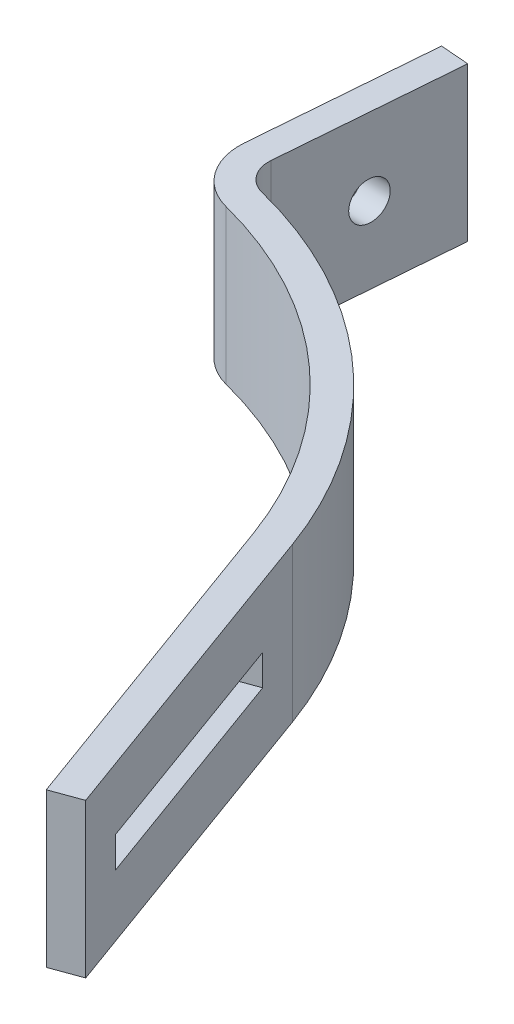
ISO-10303-21;
HEADER;
FILE_DESCRIPTION(('STEP AP214'),'2;1');
FILE_NAME('part.step','',(''),(''),'','','');
FILE_SCHEMA(('AUTOMOTIVE_DESIGN { 1 0 10303 214 1 1 1 1 }'));
ENDSEC;
DATA;
#1=APPLICATION_CONTEXT('core data for automotive mechanical design processes');
#2=APPLICATION_PROTOCOL_DEFINITION('international standard','automotive_design',2000,#1);
#3=PRODUCT_CONTEXT('',#1,'mechanical');
#4=PRODUCT('Part','Part','',(#3));
#5=PRODUCT_RELATED_PRODUCT_CATEGORY('part','',(#4));
#6=PRODUCT_DEFINITION_FORMATION('','',#4);
#7=PRODUCT_DEFINITION_CONTEXT('part definition',#1,'design');
#8=PRODUCT_DEFINITION('design','',#6,#7);
#9=PRODUCT_DEFINITION_SHAPE('','',#8);
#10=(LENGTH_UNIT() NAMED_UNIT(*) SI_UNIT(.MILLI.,.METRE.));
#11=(NAMED_UNIT(*) PLANE_ANGLE_UNIT() SI_UNIT($,.RADIAN.));
#12=(NAMED_UNIT(*) SI_UNIT($,.STERADIAN.) SOLID_ANGLE_UNIT());
#13=UNCERTAINTY_MEASURE_WITH_UNIT(LENGTH_MEASURE(1.E-05),#10,'distance_accuracy_value','');
#14=(GEOMETRIC_REPRESENTATION_CONTEXT(3) GLOBAL_UNCERTAINTY_ASSIGNED_CONTEXT((#13)) GLOBAL_UNIT_ASSIGNED_CONTEXT((#10,
#11,#12)) REPRESENTATION_CONTEXT('',''));
#15=CARTESIAN_POINT('',(0.,0.,0.));
#16=DIRECTION('',(0.,0.,1.));
#17=DIRECTION('',(1.,0.,0.));
#18=AXIS2_PLACEMENT_3D('',#15,#16,#17);
#19=CARTESIAN_POINT('',(-27.1708769324458,10.,-54.5665199545642));
#20=DIRECTION('',(-0.0798529081578771,0.,0.996806657812201));
#21=DIRECTION('',(0.996806657812201,0.,0.0798529081578771));
#22=AXIS2_PLACEMENT_3D('',#19,#20,#21);
#23=PLANE('',#22);
#24=DIRECTION('',(-0.996806657812201,0.,-0.0798529081578771));
#25=VECTOR('',#24,1.);
#26=CARTESIAN_POINT('',(-27.1708769324458,0.,-54.5665199545642));
#27=LINE('',#26,#25);
#28=CARTESIAN_POINT('',(-27.1708769324458,0.,-54.5665199545642));
#29=VERTEX_POINT('',#28);
#30=CARTESIAN_POINT('',(-29.0231215445682,0.,-54.7149009046096));
#31=VERTEX_POINT('',#30);
#32=EDGE_CURVE('E175',#29,#31,#27,.T.);
#33=ORIENTED_EDGE('',*,*,#32,.T.);
#34=DIRECTION('',(0.,-1.,0.));
#35=VECTOR('',#34,1.);
#36=CARTESIAN_POINT('',(-29.0231215445682,10.,-54.7149009046096));
#37=LINE('',#36,#35);
#38=CARTESIAN_POINT('',(-29.0231215445682,10.,-54.7149009046096));
#39=VERTEX_POINT('',#38);
#40=EDGE_CURVE('E11',#39,#31,#37,.T.);
#41=ORIENTED_EDGE('',*,*,#40,.F.);
#42=DIRECTION('',(-0.996806657812201,0.,-0.0798529081578771));
#43=VECTOR('',#42,1.);
#44=CARTESIAN_POINT('',(-27.1708769324458,10.,-54.5665199545642));
#45=LINE('',#44,#43);
#46=CARTESIAN_POINT('',(-27.1708769324458,10.,-54.5665199545642));
#47=VERTEX_POINT('',#46);
#48=EDGE_CURVE('E176',#47,#39,#45,.T.);
#49=ORIENTED_EDGE('',*,*,#48,.F.);
#50=DIRECTION('',(0.,-1.,0.));
#51=VECTOR('',#50,1.);
#52=CARTESIAN_POINT('',(-27.1708769324458,10.,-54.5665199545642));
#53=LINE('',#52,#51);
#54=EDGE_CURVE('E198',#47,#29,#53,.T.);
#55=ORIENTED_EDGE('',*,*,#54,.T.);
#56=EDGE_LOOP('',(#33,#41,#49,#55));
#57=FACE_BOUND('',#56,.T.);
#58=ADVANCED_FACE('F34',(#57),#23,.F.);
#59=CARTESIAN_POINT('',(-29.9724651651477,10.,-42.8642111379429));
#60=DIRECTION('',(0.9968066578122,0.,0.07985290815788));
#61=DIRECTION('',(0.07985290815788,0.,-0.9968066578122));
#62=AXIS2_PLACEMENT_3D('',#59,#60,#61);
#63=PLANE('',#62);
#64=CARTESIAN_POINT('',(-29.5087010246641,5.,-48.6533951958932));
#65=DIRECTION('',(0.9968066578122,0.,0.07985290815788));
#66=DIRECTION('',(0.07985290815788,0.,-0.996806657812201));
#67=AXIS2_PLACEMENT_3D('',#64,#65,#66);
#68=ELLIPSE('',#67,1.25400446536293,1.25);
#69=CARTESIAN_POINT('',(-29.4085651212619,5.,-49.9033951958932));
#70=VERTEX_POINT('',#69);
#71=EDGE_CURVE('E172',#70,#70,#68,.T.);
#72=ORIENTED_EDGE('',*,*,#71,.T.);
#73=EDGE_LOOP('',(#72));
#74=FACE_BOUND('',#73,.T.);
#75=DIRECTION('',(-0.07985290815788,0.,0.9968066578122));
#76=VECTOR('',#75,1.);
#77=CARTESIAN_POINT('',(-29.9724651651477,0.,-42.8642111379429));
#78=LINE('',#77,#76);
#79=CARTESIAN_POINT('',(-29.9724651651477,0.,-42.8642111379429));
#80=VERTEX_POINT('',#79);
#81=EDGE_CURVE('E201',#31,#80,#78,.T.);
#82=ORIENTED_EDGE('',*,*,#81,.T.);
#83=DIRECTION('',(0.,-1.,0.));
#84=VECTOR('',#83,1.);
#85=CARTESIAN_POINT('',(-29.9724651651477,10.,-42.8642111379429));
#86=LINE('',#85,#84);
#87=CARTESIAN_POINT('',(-29.9724651651477,10.,-42.8642111379429));
#88=VERTEX_POINT('',#87);
#89=EDGE_CURVE('E42',#88,#80,#86,.T.);
#90=ORIENTED_EDGE('',*,*,#89,.F.);
#91=DIRECTION('',(-0.07985290815788,0.,0.9968066578122));
#92=VECTOR('',#91,1.);
#93=CARTESIAN_POINT('',(-29.9724651651477,10.,-42.8642111379429));
#94=LINE('',#93,#92);
#95=EDGE_CURVE('E179',#39,#88,#94,.T.);
#96=ORIENTED_EDGE('',*,*,#95,.F.);
#97=ORIENTED_EDGE('',*,*,#40,.T.);
#98=EDGE_LOOP('',(#82,#90,#96,#97));
#99=FACE_BOUND('',#98,.T.);
#100=ADVANCED_FACE('F269',(#74,#99),#63,.F.);
#101=CARTESIAN_POINT('',(-25.9852385338989,10.,-42.5447995053113));
#102=DIRECTION('',(0.,-1.,0.));
#103=DIRECTION('',(0.,0.,-1.));
#104=AXIS2_PLACEMENT_3D('',#101,#102,#103);
#105=CYLINDRICAL_SURFACE('',#104,4.);
#106=CARTESIAN_POINT('',(-25.9852385338989,0.,-42.5447995053113));
#107=DIRECTION('',(0.,1.,0.));
#108=DIRECTION('',(0.,0.,1.));
#109=AXIS2_PLACEMENT_3D('',#106,#107,#108);
#110=CIRCLE('',#109,4.);
#111=CARTESIAN_POINT('',(-26.9879395430156,0.,-38.6725145614679));
#112=VERTEX_POINT('',#111);
#113=EDGE_CURVE('E203',#80,#112,#110,.T.);
#114=ORIENTED_EDGE('',*,*,#113,.T.);
#115=DIRECTION('',(0.,-1.,0.));
#116=VECTOR('',#115,1.);
#117=CARTESIAN_POINT('',(-26.9879395430156,10.,-38.6725145614679));
#118=LINE('',#117,#116);
#119=CARTESIAN_POINT('',(-26.9879395430156,10.,-38.6725145614679));
#120=VERTEX_POINT('',#119);
#121=EDGE_CURVE('E238',#120,#112,#118,.T.);
#122=ORIENTED_EDGE('',*,*,#121,.F.);
#123=CARTESIAN_POINT('',(-25.9852385338989,10.,-42.5447995053113));
#124=DIRECTION('',(0.,1.,0.));
#125=DIRECTION('',(0.,0.,1.));
#126=AXIS2_PLACEMENT_3D('',#123,#124,#125);
#127=CIRCLE('',#126,4.);
#128=EDGE_CURVE('E182',#88,#120,#127,.T.);
#129=ORIENTED_EDGE('',*,*,#128,.F.);
#130=ORIENTED_EDGE('',*,*,#89,.T.);
#131=EDGE_LOOP('',(#114,#122,#129,#130));
#132=FACE_BOUND('',#131,.T.);
#133=ADVANCED_FACE('F246',(#132),#105,.T.);
#134=CARTESIAN_POINT('',(-34.006846606833,10.,-11.5665199545642));
#135=DIRECTION('',(0.,-1.,0.));
#136=DIRECTION('',(0.,0.,-1.));
#137=AXIS2_PLACEMENT_3D('',#134,#135,#136);
#138=CYLINDRICAL_SURFACE('',#137,28.);
#139=CARTESIAN_POINT('',(-34.006846606833,0.,-11.5665199545642));
#140=DIRECTION('',(0.,-1.,0.));
#141=DIRECTION('',(0.,0.,1.));
#142=AXIS2_PLACEMENT_3D('',#139,#140,#141);
#143=CIRCLE('',#142,28.);
#144=CARTESIAN_POINT('',(-7.69545322482755,0.,-21.1430839676829));
#145=VERTEX_POINT('',#144);
#146=EDGE_CURVE('E205',#112,#145,#143,.T.);
#147=ORIENTED_EDGE('',*,*,#146,.T.);
#148=DIRECTION('',(0.,-1.,0.));
#149=VECTOR('',#148,1.);
#150=CARTESIAN_POINT('',(-7.69545322482755,10.,-21.1430839676829));
#151=LINE('',#150,#149);
#152=CARTESIAN_POINT('',(-7.69545322482755,10.,-21.1430839676829));
#153=VERTEX_POINT('',#152);
#154=EDGE_CURVE('E235',#153,#145,#151,.T.);
#155=ORIENTED_EDGE('',*,*,#154,.F.);
#156=CARTESIAN_POINT('',(-34.006846606833,10.,-11.5665199545642));
#157=DIRECTION('',(0.,-1.,0.));
#158=DIRECTION('',(0.,0.,1.));
#159=AXIS2_PLACEMENT_3D('',#156,#157,#158);
#160=CIRCLE('',#159,28.);
#161=EDGE_CURVE('E184',#120,#153,#160,.T.);
#162=ORIENTED_EDGE('',*,*,#161,.F.);
#163=ORIENTED_EDGE('',*,*,#121,.T.);
#164=EDGE_LOOP('',(#147,#155,#162,#163));
#165=FACE_BOUND('',#164,.T.);
#166=ADVANCED_FACE('F257',(#165),#138,.F.);
#167=CARTESIAN_POINT('',(-7.69545322482755,10.,-21.1430839676829));
#168=DIRECTION('',(0.939692620785908,0.,-0.342020143325669));
#169=DIRECTION('',(-0.342020143325669,0.,-0.939692620785908));
#170=AXIS2_PLACEMENT_3D('',#167,#168,#169);
#171=PLANE('',#170);
#172=DIRECTION('',(-0.342020143325669,0.,-0.939692620785908));
#173=VECTOR('',#172,1.);
#174=CARTESIAN_POINT('',(-7.69545322482755,4.,-21.1430839676829));
#175=LINE('',#174,#173);
#176=CARTESIAN_POINT('',(-1.11156546580842,4.,-3.0540010175542));
#177=VERTEX_POINT('',#176);
#178=CARTESIAN_POINT('',(-6.58388775901913,4.,-18.0890829501287));
#179=VERTEX_POINT('',#178);
#180=EDGE_CURVE('E166',#177,#179,#175,.T.);
#181=ORIENTED_EDGE('',*,*,#180,.T.);
#182=DIRECTION('',(0.,1.,0.));
#183=VECTOR('',#182,1.);
#184=CARTESIAN_POINT('',(-6.58388775901913,10.,-18.0890829501287));
#185=LINE('',#184,#183);
#186=CARTESIAN_POINT('',(-6.58388775901913,6.,-18.0890829501287));
#187=VERTEX_POINT('',#186);
#188=EDGE_CURVE('E169',#179,#187,#185,.T.);
#189=ORIENTED_EDGE('',*,*,#188,.T.);
#190=DIRECTION('',(0.342020143325669,0.,0.939692620785908));
#191=VECTOR('',#190,1.);
#192=CARTESIAN_POINT('',(-7.69545322482755,6.,-21.1430839676829));
#193=LINE('',#192,#191);
#194=CARTESIAN_POINT('',(-1.11156546580842,6.,-3.0540010175542));
#195=VERTEX_POINT('',#194);
#196=EDGE_CURVE('E161',#187,#195,#193,.T.);
#197=ORIENTED_EDGE('',*,*,#196,.T.);
#198=DIRECTION('',(0.,-1.,0.));
#199=VECTOR('',#198,1.);
#200=CARTESIAN_POINT('',(-1.11156546580842,10.,-3.0540010175542));
#201=LINE('',#200,#199);
#202=EDGE_CURVE('E141',#195,#177,#201,.T.);
#203=ORIENTED_EDGE('',*,*,#202,.T.);
#204=EDGE_LOOP('',(#181,#189,#197,#203));
#205=FACE_BOUND('',#204,.T.);
#206=DIRECTION('',(0.342020143325669,0.,0.939692620785908));
#207=VECTOR('',#206,1.);
#208=CARTESIAN_POINT('',(-7.69545322482755,0.,-21.1430839676829));
#209=LINE('',#208,#207);
#210=CARTESIAN_POINT('',(0.,0.,0.));
#211=VERTEX_POINT('',#210);
#212=EDGE_CURVE('E207',#145,#211,#209,.T.);
#213=ORIENTED_EDGE('',*,*,#212,.T.);
#214=DIRECTION('',(0.,-1.,0.));
#215=VECTOR('',#214,1.);
#216=CARTESIAN_POINT('',(0.,10.,0.));
#217=LINE('',#216,#215);
#218=CARTESIAN_POINT('',(0.,10.,0.));
#219=VERTEX_POINT('',#218);
#220=EDGE_CURVE('E232',#219,#211,#217,.T.);
#221=ORIENTED_EDGE('',*,*,#220,.F.);
#222=DIRECTION('',(0.342020143325669,0.,0.939692620785908));
#223=VECTOR('',#222,1.);
#224=CARTESIAN_POINT('',(-7.69545322482755,10.,-21.1430839676829));
#225=LINE('',#224,#223);
#226=EDGE_CURVE('E186',#153,#219,#225,.T.);
#227=ORIENTED_EDGE('',*,*,#226,.F.);
#228=ORIENTED_EDGE('',*,*,#154,.T.);
#229=EDGE_LOOP('',(#213,#221,#227,#228));
#230=FACE_BOUND('',#229,.T.);
#231=ADVANCED_FACE('F261',(#205,#230),#171,.F.);
#232=CARTESIAN_POINT('',(0.,10.,0.));
#233=DIRECTION('',(-0.342020143325669,0.,-0.939692620785908));
#234=DIRECTION('',(-0.939692620785908,0.,0.342020143325669));
#235=AXIS2_PLACEMENT_3D('',#232,#233,#234);
#236=PLANE('',#235);
#237=DIRECTION('',(0.939692620785908,0.,-0.342020143325669));
#238=VECTOR('',#237,1.);
#239=CARTESIAN_POINT('',(0.,0.,0.));
#240=LINE('',#239,#238);
#241=CARTESIAN_POINT('',(1.87938524157183,0.,-0.684040286651345));
#242=VERTEX_POINT('',#241);
#243=EDGE_CURVE('E209',#211,#242,#240,.T.);
#244=ORIENTED_EDGE('',*,*,#243,.T.);
#245=DIRECTION('',(0.,-1.,0.));
#246=VECTOR('',#245,1.);
#247=CARTESIAN_POINT('',(1.87938524157183,10.,-0.684040286651345));
#248=LINE('',#247,#246);
#249=CARTESIAN_POINT('',(1.87938524157183,10.,-0.684040286651345));
#250=VERTEX_POINT('',#249);
#251=EDGE_CURVE('E229',#250,#242,#248,.T.);
#252=ORIENTED_EDGE('',*,*,#251,.F.);
#253=DIRECTION('',(0.939692620785908,0.,-0.342020143325669));
#254=VECTOR('',#253,1.);
#255=CARTESIAN_POINT('',(0.,10.,0.));
#256=LINE('',#255,#254);
#257=EDGE_CURVE('E188',#219,#250,#256,.T.);
#258=ORIENTED_EDGE('',*,*,#257,.F.);
#259=ORIENTED_EDGE('',*,*,#220,.T.);
#260=EDGE_LOOP('',(#244,#252,#258,#259));
#261=FACE_BOUND('',#260,.T.);
#262=ADVANCED_FACE('F290',(#261),#236,.F.);
#263=CARTESIAN_POINT('',(-5.81606798325573,10.,-21.8271242543343));
#264=DIRECTION('',(-0.939692620785908,0.,0.342020143325669));
#265=DIRECTION('',(0.342020143325669,0.,0.939692620785908));
#266=AXIS2_PLACEMENT_3D('',#263,#264,#265);
#267=PLANE('',#266);
#268=DIRECTION('',(0.342020143325669,0.,0.939692620785908));
#269=VECTOR('',#268,1.);
#270=CARTESIAN_POINT('',(0.767819775763409,6.,-3.73804130420555));
#271=LINE('',#270,#269);
#272=CARTESIAN_POINT('',(-4.7045025174473,6.,-18.7731232367801));
#273=VERTEX_POINT('',#272);
#274=CARTESIAN_POINT('',(0.767819775763409,6.,-3.73804130420555));
#275=VERTEX_POINT('',#274);
#276=EDGE_CURVE('E147',#273,#275,#271,.T.);
#277=ORIENTED_EDGE('',*,*,#276,.F.);
#278=DIRECTION('',(0.,1.,0.));
#279=VECTOR('',#278,1.);
#280=CARTESIAN_POINT('',(-4.7045025174473,4.,-18.7731232367801));
#281=LINE('',#280,#279);
#282=CARTESIAN_POINT('',(-4.7045025174473,4.,-18.7731232367801));
#283=VERTEX_POINT('',#282);
#284=EDGE_CURVE('E57',#283,#273,#281,.T.);
#285=ORIENTED_EDGE('',*,*,#284,.F.);
#286=DIRECTION('',(-0.342020143325669,0.,-0.939692620785908));
#287=VECTOR('',#286,1.);
#288=CARTESIAN_POINT('',(0.767819775763409,4.,-3.73804130420555));
#289=LINE('',#288,#287);
#290=CARTESIAN_POINT('',(0.767819775763409,4.,-3.73804130420555));
#291=VERTEX_POINT('',#290);
#292=EDGE_CURVE('E154',#291,#283,#289,.T.);
#293=ORIENTED_EDGE('',*,*,#292,.F.);
#294=DIRECTION('',(0.,-1.,0.));
#295=VECTOR('',#294,1.);
#296=CARTESIAN_POINT('',(0.767819775763409,6.,-3.73804130420555));
#297=LINE('',#296,#295);
#298=EDGE_CURVE('E138',#275,#291,#297,.T.);
#299=ORIENTED_EDGE('',*,*,#298,.F.);
#300=EDGE_LOOP('',(#277,#285,#293,#299));
#301=FACE_BOUND('',#300,.T.);
#302=DIRECTION('',(-0.342020143325669,0.,-0.939692620785908));
#303=VECTOR('',#302,1.);
#304=CARTESIAN_POINT('',(-5.81606798325573,0.,-21.8271242543343));
#305=LINE('',#304,#303);
#306=CARTESIAN_POINT('',(-5.81606798325573,0.,-21.8271242543343));
#307=VERTEX_POINT('',#306);
#308=EDGE_CURVE('E211',#242,#307,#305,.T.);
#309=ORIENTED_EDGE('',*,*,#308,.T.);
#310=DIRECTION('',(0.,-1.,0.));
#311=VECTOR('',#310,1.);
#312=CARTESIAN_POINT('',(-5.81606798325573,10.,-21.8271242543343));
#313=LINE('',#312,#311);
#314=CARTESIAN_POINT('',(-5.81606798325573,10.,-21.8271242543343));
#315=VERTEX_POINT('',#314);
#316=EDGE_CURVE('E226',#315,#307,#313,.T.);
#317=ORIENTED_EDGE('',*,*,#316,.F.);
#318=DIRECTION('',(-0.342020143325669,0.,-0.939692620785908));
#319=VECTOR('',#318,1.);
#320=CARTESIAN_POINT('',(-5.81606798325573,10.,-21.8271242543343));
#321=LINE('',#320,#319);
#322=EDGE_CURVE('E190',#250,#315,#321,.T.);
#323=ORIENTED_EDGE('',*,*,#322,.F.);
#324=ORIENTED_EDGE('',*,*,#251,.T.);
#325=EDGE_LOOP('',(#309,#317,#323,#324));
#326=FACE_BOUND('',#325,.T.);
#327=ADVANCED_FACE('F151',(#301,#326),#267,.F.);
#328=CARTESIAN_POINT('',(-34.006846606833,10.,-11.5665199545642));
#329=DIRECTION('',(0.,-1.,0.));
#330=DIRECTION('',(0.,0.,-1.));
#331=AXIS2_PLACEMENT_3D('',#328,#329,#330);
#332=CYLINDRICAL_SURFACE('',#331,30.);
#333=CARTESIAN_POINT('',(-34.006846606833,0.,-11.5665199545642));
#334=DIRECTION('',(0.,1.,0.));
#335=DIRECTION('',(0.,0.,1.));
#336=AXIS2_PLACEMENT_3D('',#333,#334,#335);
#337=CIRCLE('',#336,30.);
#338=CARTESIAN_POINT('',(-26.6172866881562,0.,-40.6421868292601));
#339=VERTEX_POINT('',#338);
#340=EDGE_CURVE('E213',#307,#339,#337,.T.);
#341=ORIENTED_EDGE('',*,*,#340,.T.);
#342=DIRECTION('',(0.,-1.,0.));
#343=VECTOR('',#342,1.);
#344=CARTESIAN_POINT('',(-26.6172866881562,10.,-40.6421868292601));
#345=LINE('',#344,#343);
#346=CARTESIAN_POINT('',(-26.6172866881562,10.,-40.6421868292601));
#347=VERTEX_POINT('',#346);
#348=EDGE_CURVE('E223',#347,#339,#345,.T.);
#349=ORIENTED_EDGE('',*,*,#348,.F.);
#350=CARTESIAN_POINT('',(-34.006846606833,10.,-11.5665199545642));
#351=DIRECTION('',(0.,1.,0.));
#352=DIRECTION('',(0.,0.,1.));
#353=AXIS2_PLACEMENT_3D('',#350,#351,#352);
#354=CIRCLE('',#353,30.);
#355=EDGE_CURVE('E192',#315,#347,#354,.T.);
#356=ORIENTED_EDGE('',*,*,#355,.F.);
#357=ORIENTED_EDGE('',*,*,#316,.T.);
#358=EDGE_LOOP('',(#341,#349,#356,#357));
#359=FACE_BOUND('',#358,.T.);
#360=ADVANCED_FACE('F285',(#359),#332,.T.);
#361=CARTESIAN_POINT('',(-26.1246493602445,10.,-42.5805646209065));
#362=DIRECTION('',(0.,-1.,0.));
#363=DIRECTION('',(0.,0.,-1.));
#364=AXIS2_PLACEMENT_3D('',#361,#362,#363);
#365=CYLINDRICAL_SURFACE('',#364,1.99999999999999);
#366=CARTESIAN_POINT('',(-26.1246493602445,0.,-42.5805646209065));
#367=DIRECTION('',(0.,-1.,0.));
#368=DIRECTION('',(0.,0.,1.));
#369=AXIS2_PLACEMENT_3D('',#366,#367,#368);
#370=CIRCLE('',#369,1.99999999999999);
#371=CARTESIAN_POINT('',(-28.1182626758688,0.,-42.7402704372222));
#372=VERTEX_POINT('',#371);
#373=EDGE_CURVE('E215',#339,#372,#370,.T.);
#374=ORIENTED_EDGE('',*,*,#373,.T.);
#375=DIRECTION('',(0.,-1.,0.));
#376=VECTOR('',#375,1.);
#377=CARTESIAN_POINT('',(-28.1182626758688,10.,-42.7402704372222));
#378=LINE('',#377,#376);
#379=CARTESIAN_POINT('',(-28.1182626758688,10.,-42.7402704372222));
#380=VERTEX_POINT('',#379);
#381=EDGE_CURVE('E220',#380,#372,#378,.T.);
#382=ORIENTED_EDGE('',*,*,#381,.F.);
#383=CARTESIAN_POINT('',(-26.1246493602445,10.,-42.5805646209065));
#384=DIRECTION('',(0.,-1.,0.));
#385=DIRECTION('',(0.,0.,1.));
#386=AXIS2_PLACEMENT_3D('',#383,#384,#385);
#387=CIRCLE('',#386,1.99999999999999);
#388=EDGE_CURVE('E194',#347,#380,#387,.T.);
#389=ORIENTED_EDGE('',*,*,#388,.F.);
#390=ORIENTED_EDGE('',*,*,#348,.T.);
#391=EDGE_LOOP('',(#374,#382,#389,#390));
#392=FACE_BOUND('',#391,.T.);
#393=ADVANCED_FACE('F281',(#392),#365,.F.);
#394=CARTESIAN_POINT('',(-28.1182626758688,10.,-42.7402704372222));
#395=DIRECTION('',(-0.9968066578122,0.,-0.0798529081578805));
#396=DIRECTION('',(-0.0798529081578805,0.,0.9968066578122));
#397=AXIS2_PLACEMENT_3D('',#394,#395,#396);
#398=PLANE('',#397);
#399=CARTESIAN_POINT('',(-27.6445698041573,5.,-48.6533951958932));
#400=DIRECTION('',(-0.9968066578122,0.,-0.0798529081578805));
#401=DIRECTION('',(0.0798529081578805,0.,-0.9968066578122));
#402=AXIS2_PLACEMENT_3D('',#399,#400,#401);
#403=ELLIPSE('',#402,1.25400446536293,1.25);
#404=CARTESIAN_POINT('',(-27.5444339007551,5.,-49.9033951958932));
#405=VERTEX_POINT('',#404);
#406=EDGE_CURVE('E37',#405,#405,#403,.T.);
#407=ORIENTED_EDGE('',*,*,#406,.T.);
#408=EDGE_LOOP('',(#407));
#409=FACE_BOUND('',#408,.T.);
#410=DIRECTION('',(0.0798529081578805,0.,-0.9968066578122));
#411=VECTOR('',#410,1.);
#412=CARTESIAN_POINT('',(-28.1182626758688,0.,-42.7402704372222));
#413=LINE('',#412,#411);
#414=EDGE_CURVE('E180',#372,#29,#413,.T.);
#415=ORIENTED_EDGE('',*,*,#414,.T.);
#416=ORIENTED_EDGE('',*,*,#54,.F.);
#417=DIRECTION('',(0.0798529081578805,0.,-0.9968066578122));
#418=VECTOR('',#417,1.);
#419=CARTESIAN_POINT('',(-28.1182626758688,10.,-42.7402704372222));
#420=LINE('',#419,#418);
#421=EDGE_CURVE('E196',#380,#47,#420,.T.);
#422=ORIENTED_EDGE('',*,*,#421,.F.);
#423=ORIENTED_EDGE('',*,*,#381,.T.);
#424=EDGE_LOOP('',(#415,#416,#422,#423));
#425=FACE_BOUND('',#424,.T.);
#426=ADVANCED_FACE('F276',(#409,#425),#398,.F.);
#427=CARTESIAN_POINT('',(-25.9852385338989,10.,-42.5447995053113));
#428=DIRECTION('',(0.,1.,0.));
#429=DIRECTION('',(0.,0.,1.));
#430=AXIS2_PLACEMENT_3D('',#427,#428,#429);
#431=PLANE('',#430);
#432=ORIENTED_EDGE('',*,*,#48,.T.);
#433=ORIENTED_EDGE('',*,*,#95,.T.);
#434=ORIENTED_EDGE('',*,*,#128,.T.);
#435=ORIENTED_EDGE('',*,*,#161,.T.);
#436=ORIENTED_EDGE('',*,*,#226,.T.);
#437=ORIENTED_EDGE('',*,*,#257,.T.);
#438=ORIENTED_EDGE('',*,*,#322,.T.);
#439=ORIENTED_EDGE('',*,*,#355,.T.);
#440=ORIENTED_EDGE('',*,*,#388,.T.);
#441=ORIENTED_EDGE('',*,*,#421,.T.);
#442=EDGE_LOOP('',(#432,#433,#434,#435,#436,#437,#438,#439,#440,#441));
#443=FACE_BOUND('',#442,.T.);
#444=ADVANCED_FACE('F265',(#443),#431,.T.);
#445=CARTESIAN_POINT('',(-25.9852385338989,0.,-42.5447995053113));
#446=DIRECTION('',(0.,1.,0.));
#447=DIRECTION('',(0.,0.,1.));
#448=AXIS2_PLACEMENT_3D('',#445,#446,#447);
#449=PLANE('',#448);
#450=ORIENTED_EDGE('',*,*,#32,.F.);
#451=ORIENTED_EDGE('',*,*,#414,.F.);
#452=ORIENTED_EDGE('',*,*,#373,.F.);
#453=ORIENTED_EDGE('',*,*,#340,.F.);
#454=ORIENTED_EDGE('',*,*,#308,.F.);
#455=ORIENTED_EDGE('',*,*,#243,.F.);
#456=ORIENTED_EDGE('',*,*,#212,.F.);
#457=ORIENTED_EDGE('',*,*,#146,.F.);
#458=ORIENTED_EDGE('',*,*,#113,.F.);
#459=ORIENTED_EDGE('',*,*,#81,.F.);
#460=EDGE_LOOP('',(#450,#451,#452,#453,#454,#455,#456,#457,#458,#459));
#461=FACE_BOUND('',#460,.T.);
#462=ADVANCED_FACE('F252',(#461),#449,.F.);
#463=CARTESIAN_POINT('',(-29.9852385338989,5.,-48.6533951958932));
#464=DIRECTION('',(1.,0.,0.));
#465=DIRECTION('',(0.,0.,-1.));
#466=AXIS2_PLACEMENT_3D('',#463,#464,#465);
#467=CYLINDRICAL_SURFACE('',#466,1.25);
#468=ORIENTED_EDGE('',*,*,#406,.F.);
#469=EDGE_LOOP('',(#468));
#470=FACE_BOUND('',#469,.T.);
#471=ORIENTED_EDGE('',*,*,#71,.F.);
#472=EDGE_LOOP('',(#471));
#473=FACE_BOUND('',#472,.T.);
#474=ADVANCED_FACE('F326',(#470,#473),#467,.F.);
#475=CARTESIAN_POINT('',(-14.1014287253064,4.,-15.3529218035234));
#476=DIRECTION('',(-0.342020143325669,0.,-0.939692620785908));
#477=DIRECTION('',(-0.939692620785908,0.,0.342020143325669));
#478=AXIS2_PLACEMENT_3D('',#475,#476,#477);
#479=PLANE('',#478);
#480=DIRECTION('',(0.939692620785908,0.,-0.342020143325669));
#481=VECTOR('',#480,1.);
#482=CARTESIAN_POINT('',(-14.1014287253064,4.,-15.3529218035234));
#483=LINE('',#482,#481);
#484=EDGE_CURVE('E159',#179,#283,#483,.T.);
#485=ORIENTED_EDGE('',*,*,#484,.T.);
#486=ORIENTED_EDGE('',*,*,#284,.T.);
#487=DIRECTION('',(0.939692620785908,0.,-0.342020143325669));
#488=VECTOR('',#487,1.);
#489=CARTESIAN_POINT('',(-14.1014287253064,6.,-15.3529218035234));
#490=LINE('',#489,#488);
#491=EDGE_CURVE('E144',#187,#273,#490,.T.);
#492=ORIENTED_EDGE('',*,*,#491,.F.);
#493=ORIENTED_EDGE('',*,*,#188,.F.);
#494=EDGE_LOOP('',(#485,#486,#492,#493));
#495=FACE_BOUND('',#494,.T.);
#496=ADVANCED_FACE('F339',(#495),#479,.F.);
#497=CARTESIAN_POINT('',(-8.62910643209567,4.,-0.317839870948854));
#498=DIRECTION('',(0.,-1.,0.));
#499=DIRECTION('',(0.,0.,-1.));
#500=AXIS2_PLACEMENT_3D('',#497,#498,#499);
#501=PLANE('',#500);
#502=DIRECTION('',(0.939692620785908,0.,-0.342020143325669));
#503=VECTOR('',#502,1.);
#504=CARTESIAN_POINT('',(-8.62910643209567,4.,-0.317839870948854));
#505=LINE('',#504,#503);
#506=EDGE_CURVE('E143',#177,#291,#505,.T.);
#507=ORIENTED_EDGE('',*,*,#506,.T.);
#508=ORIENTED_EDGE('',*,*,#292,.T.);
#509=ORIENTED_EDGE('',*,*,#484,.F.);
#510=ORIENTED_EDGE('',*,*,#180,.F.);
#511=EDGE_LOOP('',(#507,#508,#509,#510));
#512=FACE_BOUND('',#511,.T.);
#513=ADVANCED_FACE('F344',(#512),#501,.F.);
#514=CARTESIAN_POINT('',(-8.62910643209567,6.,-0.317839870948854));
#515=DIRECTION('',(0.342020143325669,0.,0.939692620785908));
#516=DIRECTION('',(0.939692620785908,0.,-0.342020143325669));
#517=AXIS2_PLACEMENT_3D('',#514,#515,#516);
#518=PLANE('',#517);
#519=DIRECTION('',(0.939692620785908,0.,-0.342020143325669));
#520=VECTOR('',#519,1.);
#521=CARTESIAN_POINT('',(-8.62910643209567,6.,-0.317839870948854));
#522=LINE('',#521,#520);
#523=EDGE_CURVE('E49',#195,#275,#522,.T.);
#524=ORIENTED_EDGE('',*,*,#523,.T.);
#525=ORIENTED_EDGE('',*,*,#298,.T.);
#526=ORIENTED_EDGE('',*,*,#506,.F.);
#527=ORIENTED_EDGE('',*,*,#202,.F.);
#528=EDGE_LOOP('',(#524,#525,#526,#527));
#529=FACE_BOUND('',#528,.T.);
#530=ADVANCED_FACE('F135',(#529),#518,.F.);
#531=CARTESIAN_POINT('',(-8.62910643209567,6.,-0.317839870948854));
#532=DIRECTION('',(0.,1.,0.));
#533=DIRECTION('',(0.,0.,1.));
#534=AXIS2_PLACEMENT_3D('',#531,#532,#533);
#535=PLANE('',#534);
#536=ORIENTED_EDGE('',*,*,#491,.T.);
#537=ORIENTED_EDGE('',*,*,#276,.T.);
#538=ORIENTED_EDGE('',*,*,#523,.F.);
#539=ORIENTED_EDGE('',*,*,#196,.F.);
#540=EDGE_LOOP('',(#536,#537,#538,#539));
#541=FACE_BOUND('',#540,.T.);
#542=ADVANCED_FACE('F148',(#541),#535,.F.);
#543=CLOSED_SHELL('',(#58,#100,#133,#166,#231,#262,#327,#360,#393,#426,#444,#462,#474,#496,#513,
#530,#542));
#544=MANIFOLD_SOLID_BREP('B2',#543);
#545=ADVANCED_BREP_SHAPE_REPRESENTATION('',(#18,#544),#14);
#546=SHAPE_DEFINITION_REPRESENTATION(#9,#545);
ENDSEC;
END-ISO-10303-21;
